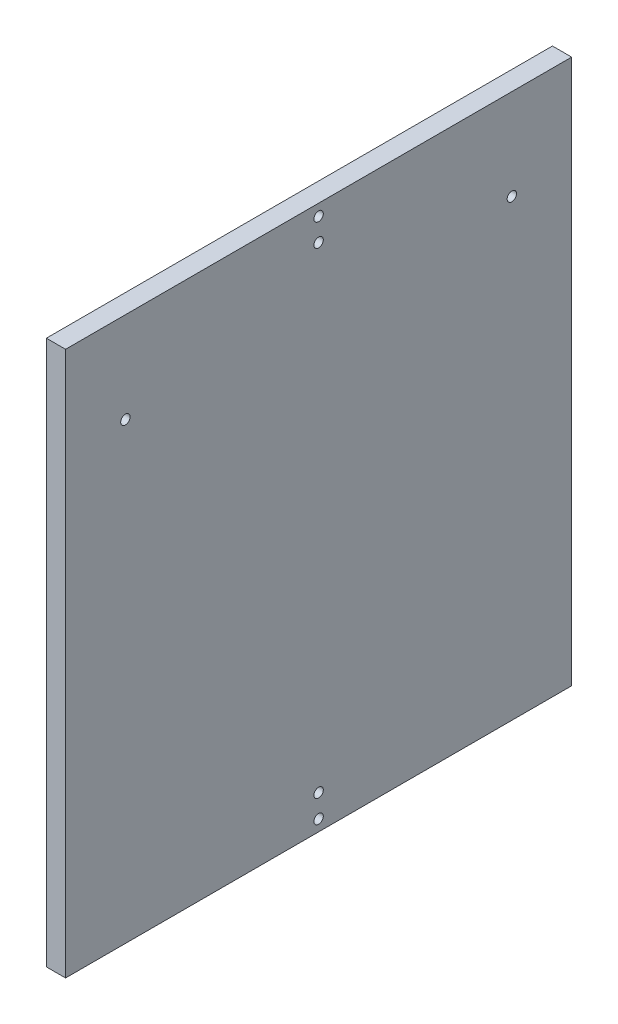
ISO-10303-21;
HEADER;
FILE_DESCRIPTION(('STEP AP214'),'2;1');
FILE_NAME('part.step','',(''),(''),'','','');
FILE_SCHEMA(('AUTOMOTIVE_DESIGN { 1 0 10303 214 1 1 1 1 }'));
ENDSEC;
DATA;
#1=APPLICATION_CONTEXT('core data for automotive mechanical design processes');
#2=APPLICATION_PROTOCOL_DEFINITION('international standard','automotive_design',2000,#1);
#3=PRODUCT_CONTEXT('',#1,'mechanical');
#4=PRODUCT('Part','Part','',(#3));
#5=PRODUCT_RELATED_PRODUCT_CATEGORY('part','',(#4));
#6=PRODUCT_DEFINITION_FORMATION('','',#4);
#7=PRODUCT_DEFINITION_CONTEXT('part definition',#1,'design');
#8=PRODUCT_DEFINITION('design','',#6,#7);
#9=PRODUCT_DEFINITION_SHAPE('','',#8);
#10=(LENGTH_UNIT() NAMED_UNIT(*) SI_UNIT(.MILLI.,.METRE.));
#11=(NAMED_UNIT(*) PLANE_ANGLE_UNIT() SI_UNIT($,.RADIAN.));
#12=(NAMED_UNIT(*) SI_UNIT($,.STERADIAN.) SOLID_ANGLE_UNIT());
#13=UNCERTAINTY_MEASURE_WITH_UNIT(LENGTH_MEASURE(1.E-05),#10,'distance_accuracy_value','');
#14=(GEOMETRIC_REPRESENTATION_CONTEXT(3) GLOBAL_UNCERTAINTY_ASSIGNED_CONTEXT((#13)) GLOBAL_UNIT_ASSIGNED_CONTEXT((#10,
#11,#12)) REPRESENTATION_CONTEXT('',''));
#15=CARTESIAN_POINT('',(0.,0.,0.));
#16=DIRECTION('',(0.,0.,1.));
#17=DIRECTION('',(1.,0.,0.));
#18=AXIS2_PLACEMENT_3D('',#15,#16,#17);
#19=CARTESIAN_POINT('',(6.35,-90.,83.65));
#20=DIRECTION('',(0.,0.,-1.));
#21=DIRECTION('',(-1.,0.,0.));
#22=AXIS2_PLACEMENT_3D('',#19,#20,#21);
#23=PLANE('',#22);
#24=DIRECTION('',(0.,-1.,0.));
#25=VECTOR('',#24,1.);
#26=CARTESIAN_POINT('',(0.,-90.,83.65));
#27=LINE('',#26,#25);
#28=CARTESIAN_POINT('',(0.,90.,83.65));
#29=VERTEX_POINT('',#28);
#30=CARTESIAN_POINT('',(0.,-90.,83.65));
#31=VERTEX_POINT('',#30);
#32=EDGE_CURVE('E96',#29,#31,#27,.T.);
#33=ORIENTED_EDGE('',*,*,#32,.T.);
#34=DIRECTION('',(-1.,0.,0.));
#35=VECTOR('',#34,1.);
#36=CARTESIAN_POINT('',(6.35,-90.,83.65));
#37=LINE('',#36,#35);
#38=CARTESIAN_POINT('',(6.35,-90.,83.65));
#39=VERTEX_POINT('',#38);
#40=EDGE_CURVE('E11',#39,#31,#37,.T.);
#41=ORIENTED_EDGE('',*,*,#40,.F.);
#42=DIRECTION('',(0.,-1.,0.));
#43=VECTOR('',#42,1.);
#44=CARTESIAN_POINT('',(6.35,-90.,83.65));
#45=LINE('',#44,#43);
#46=CARTESIAN_POINT('',(6.35,90.,83.65));
#47=VERTEX_POINT('',#46);
#48=EDGE_CURVE('E84',#47,#39,#45,.T.);
#49=ORIENTED_EDGE('',*,*,#48,.F.);
#50=DIRECTION('',(-1.,0.,0.));
#51=VECTOR('',#50,1.);
#52=CARTESIAN_POINT('',(6.35,90.,83.65));
#53=LINE('',#52,#51);
#54=EDGE_CURVE('E92',#47,#29,#53,.T.);
#55=ORIENTED_EDGE('',*,*,#54,.T.);
#56=EDGE_LOOP('',(#33,#41,#49,#55));
#57=FACE_BOUND('',#56,.T.);
#58=ADVANCED_FACE('F33',(#57),#23,.F.);
#59=CARTESIAN_POINT('',(6.35,-90.,-83.65));
#60=DIRECTION('',(0.,1.,0.));
#61=DIRECTION('',(0.,0.,1.));
#62=AXIS2_PLACEMENT_3D('',#59,#60,#61);
#63=PLANE('',#62);
#64=DIRECTION('',(0.,0.,-1.));
#65=VECTOR('',#64,1.);
#66=CARTESIAN_POINT('',(0.,-90.,-83.65));
#67=LINE('',#66,#65);
#68=CARTESIAN_POINT('',(0.,-90.,-83.65));
#69=VERTEX_POINT('',#68);
#70=EDGE_CURVE('E88',#31,#69,#67,.T.);
#71=ORIENTED_EDGE('',*,*,#70,.T.);
#72=DIRECTION('',(-1.,0.,0.));
#73=VECTOR('',#72,1.);
#74=CARTESIAN_POINT('',(6.35,-90.,-83.65));
#75=LINE('',#74,#73);
#76=CARTESIAN_POINT('',(6.35,-90.,-83.65));
#77=VERTEX_POINT('',#76);
#78=EDGE_CURVE('E41',#77,#69,#75,.T.);
#79=ORIENTED_EDGE('',*,*,#78,.F.);
#80=DIRECTION('',(0.,0.,-1.));
#81=VECTOR('',#80,1.);
#82=CARTESIAN_POINT('',(6.35,-90.,-83.65));
#83=LINE('',#82,#81);
#84=EDGE_CURVE('E79',#39,#77,#83,.T.);
#85=ORIENTED_EDGE('',*,*,#84,.F.);
#86=ORIENTED_EDGE('',*,*,#40,.T.);
#87=EDGE_LOOP('',(#71,#79,#85,#86));
#88=FACE_BOUND('',#87,.T.);
#89=ADVANCED_FACE('F87',(#88),#63,.F.);
#90=CARTESIAN_POINT('',(6.35,-90.,-83.65));
#91=DIRECTION('',(0.,0.,1.));
#92=DIRECTION('',(1.,0.,0.));
#93=AXIS2_PLACEMENT_3D('',#90,#91,#92);
#94=PLANE('',#93);
#95=DIRECTION('',(0.,1.,0.));
#96=VECTOR('',#95,1.);
#97=CARTESIAN_POINT('',(0.,-90.,-83.65));
#98=LINE('',#97,#96);
#99=CARTESIAN_POINT('',(0.,90.,-83.65));
#100=VERTEX_POINT('',#99);
#101=EDGE_CURVE('E66',#69,#100,#98,.T.);
#102=ORIENTED_EDGE('',*,*,#101,.T.);
#103=DIRECTION('',(-1.,0.,0.));
#104=VECTOR('',#103,1.);
#105=CARTESIAN_POINT('',(6.35,90.,-83.65));
#106=LINE('',#105,#104);
#107=CARTESIAN_POINT('',(6.35,90.,-83.65));
#108=VERTEX_POINT('',#107);
#109=EDGE_CURVE('E89',#108,#100,#106,.T.);
#110=ORIENTED_EDGE('',*,*,#109,.F.);
#111=DIRECTION('',(0.,1.,0.));
#112=VECTOR('',#111,1.);
#113=CARTESIAN_POINT('',(6.35,-90.,-83.65));
#114=LINE('',#113,#112);
#115=EDGE_CURVE('E82',#77,#108,#114,.T.);
#116=ORIENTED_EDGE('',*,*,#115,.F.);
#117=ORIENTED_EDGE('',*,*,#78,.T.);
#118=EDGE_LOOP('',(#102,#110,#116,#117));
#119=FACE_BOUND('',#118,.T.);
#120=ADVANCED_FACE('F90',(#119),#94,.F.);
#121=CARTESIAN_POINT('',(6.35,90.,-83.65));
#122=DIRECTION('',(0.,-1.,0.));
#123=DIRECTION('',(0.,0.,-1.));
#124=AXIS2_PLACEMENT_3D('',#121,#122,#123);
#125=PLANE('',#124);
#126=DIRECTION('',(0.,0.,1.));
#127=VECTOR('',#126,1.);
#128=CARTESIAN_POINT('',(0.,90.,-83.65));
#129=LINE('',#128,#127);
#130=EDGE_CURVE('E72',#100,#29,#129,.T.);
#131=ORIENTED_EDGE('',*,*,#130,.T.);
#132=ORIENTED_EDGE('',*,*,#54,.F.);
#133=DIRECTION('',(0.,0.,1.));
#134=VECTOR('',#133,1.);
#135=CARTESIAN_POINT('',(6.35,90.,-83.65));
#136=LINE('',#135,#134);
#137=EDGE_CURVE('E49',#108,#47,#136,.T.);
#138=ORIENTED_EDGE('',*,*,#137,.F.);
#139=ORIENTED_EDGE('',*,*,#109,.T.);
#140=EDGE_LOOP('',(#131,#132,#138,#139));
#141=FACE_BOUND('',#140,.T.);
#142=ADVANCED_FACE('F104',(#141),#125,.F.);
#143=CARTESIAN_POINT('',(6.35,0.,0.));
#144=DIRECTION('',(1.,0.,0.));
#145=DIRECTION('',(0.,0.,-1.));
#146=AXIS2_PLACEMENT_3D('',#143,#144,#145);
#147=PLANE('',#146);
#148=CARTESIAN_POINT('',(6.35,86.25,0.));
#149=DIRECTION('',(-1.,0.,0.));
#150=DIRECTION('',(0.,0.,1.));
#151=AXIS2_PLACEMENT_3D('',#148,#149,#150);
#152=CIRCLE('',#151,1.554);
#153=CARTESIAN_POINT('',(6.35,86.25,1.554));
#154=VERTEX_POINT('',#153);
#155=EDGE_CURVE('E139',#154,#154,#152,.T.);
#156=ORIENTED_EDGE('',*,*,#155,.T.);
#157=EDGE_LOOP('',(#156));
#158=FACE_BOUND('',#157,.T.);
#159=CARTESIAN_POINT('',(6.35,78.75,0.));
#160=DIRECTION('',(-1.,0.,0.));
#161=DIRECTION('',(0.,0.,1.));
#162=AXIS2_PLACEMENT_3D('',#159,#160,#161);
#163=CIRCLE('',#162,1.554);
#164=CARTESIAN_POINT('',(6.35,78.75,1.554));
#165=VERTEX_POINT('',#164);
#166=EDGE_CURVE('E133',#165,#165,#163,.T.);
#167=ORIENTED_EDGE('',*,*,#166,.T.);
#168=EDGE_LOOP('',(#167));
#169=FACE_BOUND('',#168,.T.);
#170=CARTESIAN_POINT('',(6.35,-78.75,0.));
#171=DIRECTION('',(-1.,0.,0.));
#172=DIRECTION('',(0.,0.,1.));
#173=AXIS2_PLACEMENT_3D('',#170,#171,#172);
#174=CIRCLE('',#173,1.554);
#175=CARTESIAN_POINT('',(6.35,-78.75,1.55400000000003));
#176=VERTEX_POINT('',#175);
#177=EDGE_CURVE('E127',#176,#176,#174,.T.);
#178=ORIENTED_EDGE('',*,*,#177,.T.);
#179=EDGE_LOOP('',(#178));
#180=FACE_BOUND('',#179,.T.);
#181=CARTESIAN_POINT('',(6.35,-86.25,0.));
#182=DIRECTION('',(-1.,0.,0.));
#183=DIRECTION('',(0.,0.,1.));
#184=AXIS2_PLACEMENT_3D('',#181,#182,#183);
#185=CIRCLE('',#184,1.554);
#186=CARTESIAN_POINT('',(6.35,-86.25,1.55400000000003));
#187=VERTEX_POINT('',#186);
#188=EDGE_CURVE('E119',#187,#187,#185,.T.);
#189=ORIENTED_EDGE('',*,*,#188,.T.);
#190=EDGE_LOOP('',(#189));
#191=FACE_BOUND('',#190,.T.);
#192=CARTESIAN_POINT('',(6.35,60.,63.88304723));
#193=DIRECTION('',(-1.,0.,0.));
#194=DIRECTION('',(0.,0.,1.));
#195=AXIS2_PLACEMENT_3D('',#192,#193,#194);
#196=CIRCLE('',#195,1.54999999999999);
#197=CARTESIAN_POINT('',(6.35,60.,65.43304723));
#198=VERTEX_POINT('',#197);
#199=EDGE_CURVE('E113',#198,#198,#196,.T.);
#200=ORIENTED_EDGE('',*,*,#199,.T.);
#201=EDGE_LOOP('',(#200));
#202=FACE_BOUND('',#201,.T.);
#203=CARTESIAN_POINT('',(6.35,60.,-63.88304723));
#204=DIRECTION('',(-1.,0.,0.));
#205=DIRECTION('',(0.,0.,1.));
#206=AXIS2_PLACEMENT_3D('',#203,#204,#205);
#207=CIRCLE('',#206,1.54999999999999);
#208=CARTESIAN_POINT('',(6.35,60.,-62.33304723));
#209=VERTEX_POINT('',#208);
#210=EDGE_CURVE('E99',#209,#209,#207,.T.);
#211=ORIENTED_EDGE('',*,*,#210,.T.);
#212=EDGE_LOOP('',(#211));
#213=FACE_BOUND('',#212,.T.);
#214=ORIENTED_EDGE('',*,*,#48,.T.);
#215=ORIENTED_EDGE('',*,*,#84,.T.);
#216=ORIENTED_EDGE('',*,*,#115,.T.);
#217=ORIENTED_EDGE('',*,*,#137,.T.);
#218=EDGE_LOOP('',(#214,#215,#216,#217));
#219=FACE_BOUND('',#218,.T.);
#220=ADVANCED_FACE('F80',(#158,#169,#180,#191,#202,#213,#219),#147,.T.);
#221=CARTESIAN_POINT('',(0.,0.,0.));
#222=DIRECTION('',(1.,0.,0.));
#223=DIRECTION('',(0.,0.,-1.));
#224=AXIS2_PLACEMENT_3D('',#221,#222,#223);
#225=PLANE('',#224);
#226=CARTESIAN_POINT('',(0.,86.25,0.));
#227=DIRECTION('',(-1.,0.,0.));
#228=DIRECTION('',(0.,0.,1.));
#229=AXIS2_PLACEMENT_3D('',#226,#227,#228);
#230=CIRCLE('',#229,1.55399999999999);
#231=CARTESIAN_POINT('',(0.,86.25,1.55399999999999));
#232=VERTEX_POINT('',#231);
#233=EDGE_CURVE('E142',#232,#232,#230,.T.);
#234=ORIENTED_EDGE('',*,*,#233,.F.);
#235=EDGE_LOOP('',(#234));
#236=FACE_BOUND('',#235,.T.);
#237=CARTESIAN_POINT('',(0.,78.75,0.));
#238=DIRECTION('',(-1.,0.,0.));
#239=DIRECTION('',(0.,0.,1.));
#240=AXIS2_PLACEMENT_3D('',#237,#238,#239);
#241=CIRCLE('',#240,1.55399999999999);
#242=CARTESIAN_POINT('',(0.,78.75,1.55399999999999));
#243=VERTEX_POINT('',#242);
#244=EDGE_CURVE('E136',#243,#243,#241,.T.);
#245=ORIENTED_EDGE('',*,*,#244,.F.);
#246=EDGE_LOOP('',(#245));
#247=FACE_BOUND('',#246,.T.);
#248=CARTESIAN_POINT('',(0.,-78.75,0.));
#249=DIRECTION('',(-1.,0.,0.));
#250=DIRECTION('',(0.,0.,1.));
#251=AXIS2_PLACEMENT_3D('',#248,#249,#250);
#252=CIRCLE('',#251,1.55399999999999);
#253=CARTESIAN_POINT('',(0.,-78.75,1.55400000000001));
#254=VERTEX_POINT('',#253);
#255=EDGE_CURVE('E130',#254,#254,#252,.T.);
#256=ORIENTED_EDGE('',*,*,#255,.F.);
#257=EDGE_LOOP('',(#256));
#258=FACE_BOUND('',#257,.T.);
#259=CARTESIAN_POINT('',(0.,-86.25,0.));
#260=DIRECTION('',(-1.,0.,0.));
#261=DIRECTION('',(0.,0.,1.));
#262=AXIS2_PLACEMENT_3D('',#259,#260,#261);
#263=CIRCLE('',#262,1.55399999999999);
#264=CARTESIAN_POINT('',(0.,-86.25,1.55400000000001));
#265=VERTEX_POINT('',#264);
#266=EDGE_CURVE('E124',#265,#265,#263,.T.);
#267=ORIENTED_EDGE('',*,*,#266,.F.);
#268=EDGE_LOOP('',(#267));
#269=FACE_BOUND('',#268,.T.);
#270=CARTESIAN_POINT('',(0.,60.,63.88304723));
#271=DIRECTION('',(-1.,0.,0.));
#272=DIRECTION('',(0.,0.,1.));
#273=AXIS2_PLACEMENT_3D('',#270,#271,#272);
#274=CIRCLE('',#273,1.54999999999999);
#275=CARTESIAN_POINT('',(0.,60.,65.43304723));
#276=VERTEX_POINT('',#275);
#277=EDGE_CURVE('E116',#276,#276,#274,.T.);
#278=ORIENTED_EDGE('',*,*,#277,.F.);
#279=EDGE_LOOP('',(#278));
#280=FACE_BOUND('',#279,.T.);
#281=CARTESIAN_POINT('',(0.,60.,-63.88304723));
#282=DIRECTION('',(-1.,0.,0.));
#283=DIRECTION('',(0.,0.,1.));
#284=AXIS2_PLACEMENT_3D('',#281,#282,#283);
#285=CIRCLE('',#284,1.54999999999999);
#286=CARTESIAN_POINT('',(0.,60.,-62.33304723));
#287=VERTEX_POINT('',#286);
#288=EDGE_CURVE('E110',#287,#287,#285,.T.);
#289=ORIENTED_EDGE('',*,*,#288,.F.);
#290=EDGE_LOOP('',(#289));
#291=FACE_BOUND('',#290,.T.);
#292=ORIENTED_EDGE('',*,*,#32,.F.);
#293=ORIENTED_EDGE('',*,*,#130,.F.);
#294=ORIENTED_EDGE('',*,*,#101,.F.);
#295=ORIENTED_EDGE('',*,*,#70,.F.);
#296=EDGE_LOOP('',(#292,#293,#294,#295));
#297=FACE_BOUND('',#296,.T.);
#298=ADVANCED_FACE('F107',(#236,#247,#258,#269,#280,#291,#297),#225,.F.);
#299=CARTESIAN_POINT('',(6.35,60.,-63.88304723));
#300=DIRECTION('',(-1.,0.,0.));
#301=DIRECTION('',(0.,0.,1.));
#302=AXIS2_PLACEMENT_3D('',#299,#300,#301);
#303=CYLINDRICAL_SURFACE('',#302,1.54999999999999);
#304=ORIENTED_EDGE('',*,*,#210,.F.);
#305=EDGE_LOOP('',(#304));
#306=FACE_BOUND('',#305,.T.);
#307=ORIENTED_EDGE('',*,*,#288,.T.);
#308=EDGE_LOOP('',(#307));
#309=FACE_BOUND('',#308,.T.);
#310=ADVANCED_FACE('F150',(#306,#309),#303,.F.);
#311=CARTESIAN_POINT('',(6.35,60.,63.88304723));
#312=DIRECTION('',(-1.,0.,0.));
#313=DIRECTION('',(0.,0.,1.));
#314=AXIS2_PLACEMENT_3D('',#311,#312,#313);
#315=CYLINDRICAL_SURFACE('',#314,1.54999999999999);
#316=ORIENTED_EDGE('',*,*,#199,.F.);
#317=EDGE_LOOP('',(#316));
#318=FACE_BOUND('',#317,.T.);
#319=ORIENTED_EDGE('',*,*,#277,.T.);
#320=EDGE_LOOP('',(#319));
#321=FACE_BOUND('',#320,.T.);
#322=ADVANCED_FACE('F163',(#318,#321),#315,.F.);
#323=CARTESIAN_POINT('',(0.,-86.25,0.));
#324=DIRECTION('',(-1.,0.,0.));
#325=DIRECTION('',(0.,0.,1.));
#326=AXIS2_PLACEMENT_3D('',#323,#324,#325);
#327=CYLINDRICAL_SURFACE('',#326,1.55399999999999);
#328=ORIENTED_EDGE('',*,*,#188,.F.);
#329=EDGE_LOOP('',(#328));
#330=FACE_BOUND('',#329,.T.);
#331=ORIENTED_EDGE('',*,*,#266,.T.);
#332=EDGE_LOOP('',(#331));
#333=FACE_BOUND('',#332,.T.);
#334=ADVANCED_FACE('F170',(#330,#333),#327,.F.);
#335=CARTESIAN_POINT('',(0.,-78.75,0.));
#336=DIRECTION('',(-1.,0.,0.));
#337=DIRECTION('',(0.,0.,1.));
#338=AXIS2_PLACEMENT_3D('',#335,#336,#337);
#339=CYLINDRICAL_SURFACE('',#338,1.55399999999999);
#340=ORIENTED_EDGE('',*,*,#177,.F.);
#341=EDGE_LOOP('',(#340));
#342=FACE_BOUND('',#341,.T.);
#343=ORIENTED_EDGE('',*,*,#255,.T.);
#344=EDGE_LOOP('',(#343));
#345=FACE_BOUND('',#344,.T.);
#346=ADVANCED_FACE('F204',(#342,#345),#339,.F.);
#347=CARTESIAN_POINT('',(0.,78.75,0.));
#348=DIRECTION('',(-1.,0.,0.));
#349=DIRECTION('',(0.,0.,1.));
#350=AXIS2_PLACEMENT_3D('',#347,#348,#349);
#351=CYLINDRICAL_SURFACE('',#350,1.55399999999999);
#352=ORIENTED_EDGE('',*,*,#166,.F.);
#353=EDGE_LOOP('',(#352));
#354=FACE_BOUND('',#353,.T.);
#355=ORIENTED_EDGE('',*,*,#244,.T.);
#356=EDGE_LOOP('',(#355));
#357=FACE_BOUND('',#356,.T.);
#358=ADVANCED_FACE('F209',(#354,#357),#351,.F.);
#359=CARTESIAN_POINT('',(0.,86.25,0.));
#360=DIRECTION('',(-1.,0.,0.));
#361=DIRECTION('',(0.,0.,1.));
#362=AXIS2_PLACEMENT_3D('',#359,#360,#361);
#363=CYLINDRICAL_SURFACE('',#362,1.55399999999999);
#364=ORIENTED_EDGE('',*,*,#155,.F.);
#365=EDGE_LOOP('',(#364));
#366=FACE_BOUND('',#365,.T.);
#367=ORIENTED_EDGE('',*,*,#233,.T.);
#368=EDGE_LOOP('',(#367));
#369=FACE_BOUND('',#368,.T.);
#370=ADVANCED_FACE('F146',(#366,#369),#363,.F.);
#371=CLOSED_SHELL('',(#58,#89,#120,#142,#220,#298,#310,#322,#334,#346,#358,#370));
#372=MANIFOLD_SOLID_BREP('B2',#371);
#373=ADVANCED_BREP_SHAPE_REPRESENTATION('',(#18,#372),#14);
#374=SHAPE_DEFINITION_REPRESENTATION(#9,#373);
ENDSEC;
END-ISO-10303-21;
